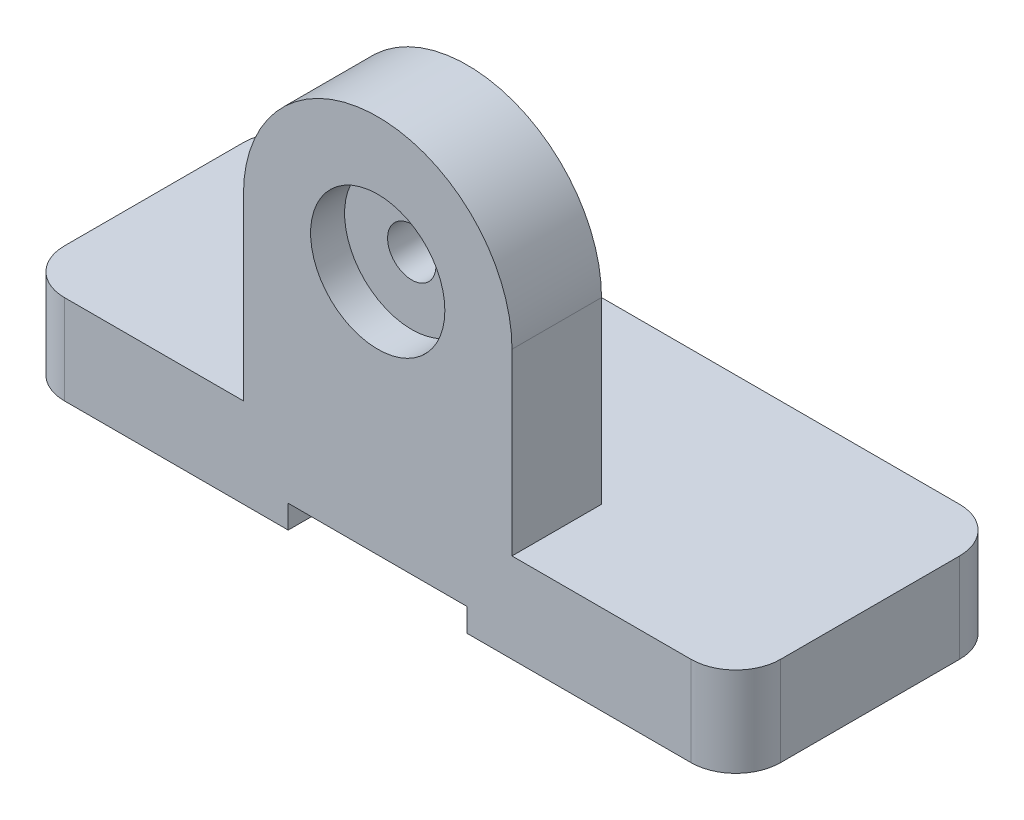
ISO-10303-21;
HEADER;
FILE_DESCRIPTION(('STEP AP214'),'2;1');
FILE_NAME('part.step','',(''),(''),'','','');
FILE_SCHEMA(('AUTOMOTIVE_DESIGN { 1 0 10303 214 1 1 1 1 }'));
ENDSEC;
DATA;
#1=APPLICATION_CONTEXT('core data for automotive mechanical design processes');
#2=APPLICATION_PROTOCOL_DEFINITION('international standard','automotive_design',2000,#1);
#3=PRODUCT_CONTEXT('',#1,'mechanical');
#4=PRODUCT('Part','Part','',(#3));
#5=PRODUCT_RELATED_PRODUCT_CATEGORY('part','',(#4));
#6=PRODUCT_DEFINITION_FORMATION('','',#4);
#7=PRODUCT_DEFINITION_CONTEXT('part definition',#1,'design');
#8=PRODUCT_DEFINITION('design','',#6,#7);
#9=PRODUCT_DEFINITION_SHAPE('','',#8);
#10=(LENGTH_UNIT() NAMED_UNIT(*) SI_UNIT(.MILLI.,.METRE.));
#11=(NAMED_UNIT(*) PLANE_ANGLE_UNIT() SI_UNIT($,.RADIAN.));
#12=(NAMED_UNIT(*) SI_UNIT($,.STERADIAN.) SOLID_ANGLE_UNIT());
#13=UNCERTAINTY_MEASURE_WITH_UNIT(LENGTH_MEASURE(1.E-05),#10,'distance_accuracy_value','');
#14=(GEOMETRIC_REPRESENTATION_CONTEXT(3) GLOBAL_UNCERTAINTY_ASSIGNED_CONTEXT((#13)) GLOBAL_UNIT_ASSIGNED_CONTEXT((#10,
#11,#12)) REPRESENTATION_CONTEXT('',''));
#15=CARTESIAN_POINT('',(0.,0.,0.));
#16=DIRECTION('',(0.,0.,1.));
#17=DIRECTION('',(1.,0.,0.));
#18=AXIS2_PLACEMENT_3D('',#15,#16,#17);
#19=CARTESIAN_POINT('',(0.,0.,0.));
#20=DIRECTION('',(0.,1.,0.));
#21=DIRECTION('',(0.,0.,1.));
#22=AXIS2_PLACEMENT_3D('',#19,#20,#21);
#23=PLANE('',#22);
#24=DIRECTION('',(0.,0.,1.));
#25=VECTOR('',#24,1.);
#26=CARTESIAN_POINT('',(-50.8,0.,19.05));
#27=LINE('',#26,#25);
#28=CARTESIAN_POINT('',(-50.8,0.,-12.7));
#29=VERTEX_POINT('',#28);
#30=CARTESIAN_POINT('',(-50.8,0.,12.7));
#31=VERTEX_POINT('',#30);
#32=EDGE_CURVE('E206',#29,#31,#27,.T.);
#33=ORIENTED_EDGE('',*,*,#32,.F.);
#34=CARTESIAN_POINT('',(-44.45,0.,-12.7));
#35=DIRECTION('',(0.,1.,0.));
#36=DIRECTION('',(0.,0.,1.));
#37=AXIS2_PLACEMENT_3D('',#34,#35,#36);
#38=CIRCLE('',#37,6.35);
#39=CARTESIAN_POINT('',(-44.45,0.,-19.05));
#40=VERTEX_POINT('',#39);
#41=EDGE_CURVE('E245',#29,#40,#38,.F.);
#42=ORIENTED_EDGE('',*,*,#41,.T.);
#43=DIRECTION('',(-1.,0.,0.));
#44=VECTOR('',#43,1.);
#45=CARTESIAN_POINT('',(50.8,0.,-19.05));
#46=LINE('',#45,#44);
#47=CARTESIAN_POINT('',(-12.7,0.,-19.05));
#48=VERTEX_POINT('',#47);
#49=EDGE_CURVE('E232',#48,#40,#46,.T.);
#50=ORIENTED_EDGE('',*,*,#49,.F.);
#51=DIRECTION('',(0.,0.,1.));
#52=VECTOR('',#51,1.);
#53=CARTESIAN_POINT('',(-12.7,0.,-19.05));
#54=LINE('',#53,#52);
#55=CARTESIAN_POINT('',(-12.7,0.,19.05));
#56=VERTEX_POINT('',#55);
#57=EDGE_CURVE('E195',#48,#56,#54,.T.);
#58=ORIENTED_EDGE('',*,*,#57,.T.);
#59=DIRECTION('',(1.,0.,0.));
#60=VECTOR('',#59,1.);
#61=CARTESIAN_POINT('',(50.8,0.,19.05));
#62=LINE('',#61,#60);
#63=CARTESIAN_POINT('',(-44.45,0.,19.05));
#64=VERTEX_POINT('',#63);
#65=EDGE_CURVE('E228',#64,#56,#62,.T.);
#66=ORIENTED_EDGE('',*,*,#65,.F.);
#67=CARTESIAN_POINT('',(-44.45,0.,12.7));
#68=DIRECTION('',(0.,1.,0.));
#69=DIRECTION('',(0.,0.,1.));
#70=AXIS2_PLACEMENT_3D('',#67,#68,#69);
#71=CIRCLE('',#70,6.35);
#72=EDGE_CURVE('E243',#64,#31,#71,.F.);
#73=ORIENTED_EDGE('',*,*,#72,.T.);
#74=EDGE_LOOP('',(#33,#42,#50,#58,#66,#73));
#75=FACE_BOUND('',#74,.T.);
#76=ADVANCED_FACE('F36',(#75),#23,.F.);
#77=CARTESIAN_POINT('',(-50.8,12.7,19.05));
#78=DIRECTION('',(1.,0.,0.));
#79=DIRECTION('',(0.,0.,-1.));
#80=AXIS2_PLACEMENT_3D('',#77,#78,#79);
#81=PLANE('',#80);
#82=DIRECTION('',(0.,0.,1.));
#83=VECTOR('',#82,1.);
#84=CARTESIAN_POINT('',(-50.8,12.7,19.05));
#85=LINE('',#84,#83);
#86=CARTESIAN_POINT('',(-50.8,12.7,-12.7));
#87=VERTEX_POINT('',#86);
#88=CARTESIAN_POINT('',(-50.8,12.7,12.7));
#89=VERTEX_POINT('',#88);
#90=EDGE_CURVE('E213',#87,#89,#85,.T.);
#91=ORIENTED_EDGE('',*,*,#90,.F.);
#92=DIRECTION('',(0.,-1.,0.));
#93=VECTOR('',#92,1.);
#94=CARTESIAN_POINT('',(-50.8,12.7,-12.7));
#95=LINE('',#94,#93);
#96=EDGE_CURVE('E240',#87,#29,#95,.T.);
#97=ORIENTED_EDGE('',*,*,#96,.T.);
#98=ORIENTED_EDGE('',*,*,#32,.T.);
#99=DIRECTION('',(0.,-1.,0.));
#100=VECTOR('',#99,1.);
#101=CARTESIAN_POINT('',(-50.8,12.7,12.7));
#102=LINE('',#101,#100);
#103=EDGE_CURVE('E224',#31,#89,#102,.F.);
#104=ORIENTED_EDGE('',*,*,#103,.T.);
#105=EDGE_LOOP('',(#91,#97,#98,#104));
#106=FACE_BOUND('',#105,.T.);
#107=ADVANCED_FACE('F305',(#106),#81,.F.);
#108=CARTESIAN_POINT('',(50.8,12.7,19.05));
#109=DIRECTION('',(0.,0.,-1.));
#110=DIRECTION('',(-1.,0.,0.));
#111=AXIS2_PLACEMENT_3D('',#108,#109,#110);
#112=PLANE('',#111);
#113=CARTESIAN_POINT('',(0.,38.1,19.05));
#114=DIRECTION('',(0.,0.,1.));
#115=DIRECTION('',(1.,0.,0.));
#116=AXIS2_PLACEMENT_3D('',#113,#114,#115);
#117=CIRCLE('',#116,9.525);
#118=CARTESIAN_POINT('',(9.525,38.1,19.05));
#119=VERTEX_POINT('',#118);
#120=EDGE_CURVE('E506',#119,#119,#117,.T.);
#121=ORIENTED_EDGE('',*,*,#120,.F.);
#122=EDGE_LOOP('',(#121));
#123=FACE_BOUND('',#122,.T.);
#124=DIRECTION('',(1.,0.,0.));
#125=VECTOR('',#124,1.);
#126=CARTESIAN_POINT('',(50.8,12.7,19.05));
#127=LINE('',#126,#125);
#128=CARTESIAN_POINT('',(-44.45,12.7,19.05));
#129=VERTEX_POINT('',#128);
#130=CARTESIAN_POINT('',(-19.05,12.7,19.05));
#131=VERTEX_POINT('',#130);
#132=EDGE_CURVE('E176',#129,#131,#127,.T.);
#133=ORIENTED_EDGE('',*,*,#132,.F.);
#134=DIRECTION('',(0.,-1.,0.));
#135=VECTOR('',#134,1.);
#136=CARTESIAN_POINT('',(-44.45,12.7,19.05));
#137=LINE('',#136,#135);
#138=EDGE_CURVE('E11',#129,#64,#137,.T.);
#139=ORIENTED_EDGE('',*,*,#138,.T.);
#140=ORIENTED_EDGE('',*,*,#65,.T.);
#141=DIRECTION('',(0.,-1.,0.));
#142=VECTOR('',#141,1.);
#143=CARTESIAN_POINT('',(-12.7,0.,19.05));
#144=LINE('',#143,#142);
#145=CARTESIAN_POINT('',(-12.7,3.302,19.05));
#146=VERTEX_POINT('',#145);
#147=EDGE_CURVE('E196',#146,#56,#144,.T.);
#148=ORIENTED_EDGE('',*,*,#147,.F.);
#149=DIRECTION('',(-1.,0.,0.));
#150=VECTOR('',#149,1.);
#151=CARTESIAN_POINT('',(-12.7,3.302,19.05));
#152=LINE('',#151,#150);
#153=CARTESIAN_POINT('',(12.7,3.302,19.05));
#154=VERTEX_POINT('',#153);
#155=EDGE_CURVE('E189',#154,#146,#152,.T.);
#156=ORIENTED_EDGE('',*,*,#155,.F.);
#157=DIRECTION('',(0.,1.,0.));
#158=VECTOR('',#157,1.);
#159=CARTESIAN_POINT('',(12.7,0.,19.05));
#160=LINE('',#159,#158);
#161=CARTESIAN_POINT('',(12.7,0.,19.05));
#162=VERTEX_POINT('',#161);
#163=EDGE_CURVE('E199',#162,#154,#160,.T.);
#164=ORIENTED_EDGE('',*,*,#163,.F.);
#165=CARTESIAN_POINT('',(44.45,0.,19.05));
#166=VERTEX_POINT('',#165);
#167=EDGE_CURVE('E227',#162,#166,#62,.T.);
#168=ORIENTED_EDGE('',*,*,#167,.T.);
#169=DIRECTION('',(0.,-1.,0.));
#170=VECTOR('',#169,1.);
#171=CARTESIAN_POINT('',(44.45,12.7,19.05));
#172=LINE('',#171,#170);
#173=CARTESIAN_POINT('',(44.45,12.7,19.05));
#174=VERTEX_POINT('',#173);
#175=EDGE_CURVE('E44',#166,#174,#172,.F.);
#176=ORIENTED_EDGE('',*,*,#175,.T.);
#177=CARTESIAN_POINT('',(19.05,12.7,19.05));
#178=VERTEX_POINT('',#177);
#179=EDGE_CURVE('E216',#178,#174,#127,.T.);
#180=ORIENTED_EDGE('',*,*,#179,.F.);
#181=DIRECTION('',(0.,1.,0.));
#182=VECTOR('',#181,1.);
#183=CARTESIAN_POINT('',(19.05,12.7,19.05));
#184=LINE('',#183,#182);
#185=CARTESIAN_POINT('',(19.05,38.1,19.05));
#186=VERTEX_POINT('',#185);
#187=EDGE_CURVE('E316',#178,#186,#184,.T.);
#188=ORIENTED_EDGE('',*,*,#187,.T.);
#189=CARTESIAN_POINT('',(0.,38.1,19.05));
#190=DIRECTION('',(0.,0.,1.));
#191=DIRECTION('',(-1.,0.,0.));
#192=AXIS2_PLACEMENT_3D('',#189,#190,#191);
#193=CIRCLE('',#192,19.05);
#194=CARTESIAN_POINT('',(-19.05,38.1,19.05));
#195=VERTEX_POINT('',#194);
#196=EDGE_CURVE('E171',#186,#195,#193,.T.);
#197=ORIENTED_EDGE('',*,*,#196,.T.);
#198=DIRECTION('',(0.,-1.,0.));
#199=VECTOR('',#198,1.);
#200=CARTESIAN_POINT('',(-19.05,12.7,19.05));
#201=LINE('',#200,#199);
#202=EDGE_CURVE('E237',#195,#131,#201,.T.);
#203=ORIENTED_EDGE('',*,*,#202,.T.);
#204=EDGE_LOOP('',(#133,#139,#140,#148,#156,#164,#168,#176,#180,#188,#197,#203));
#205=FACE_BOUND('',#204,.T.);
#206=ADVANCED_FACE('F269',(#123,#205),#112,.F.);
#207=CARTESIAN_POINT('',(50.8,12.7,19.05));
#208=DIRECTION('',(-1.,0.,0.));
#209=DIRECTION('',(0.,0.,1.));
#210=AXIS2_PLACEMENT_3D('',#207,#208,#209);
#211=PLANE('',#210);
#212=DIRECTION('',(0.,0.,-1.));
#213=VECTOR('',#212,1.);
#214=CARTESIAN_POINT('',(50.8,0.,19.05));
#215=LINE('',#214,#213);
#216=CARTESIAN_POINT('',(50.8,0.,12.7));
#217=VERTEX_POINT('',#216);
#218=CARTESIAN_POINT('',(50.8,0.,-12.7));
#219=VERTEX_POINT('',#218);
#220=EDGE_CURVE('E230',#217,#219,#215,.T.);
#221=ORIENTED_EDGE('',*,*,#220,.T.);
#222=DIRECTION('',(0.,-1.,0.));
#223=VECTOR('',#222,1.);
#224=CARTESIAN_POINT('',(50.8,12.7,-12.7));
#225=LINE('',#224,#223);
#226=CARTESIAN_POINT('',(50.8,12.7,-12.7));
#227=VERTEX_POINT('',#226);
#228=EDGE_CURVE('E264',#219,#227,#225,.F.);
#229=ORIENTED_EDGE('',*,*,#228,.T.);
#230=DIRECTION('',(0.,0.,-1.));
#231=VECTOR('',#230,1.);
#232=CARTESIAN_POINT('',(50.8,12.7,19.05));
#233=LINE('',#232,#231);
#234=CARTESIAN_POINT('',(50.8,12.7,12.7));
#235=VERTEX_POINT('',#234);
#236=EDGE_CURVE('E219',#235,#227,#233,.T.);
#237=ORIENTED_EDGE('',*,*,#236,.F.);
#238=DIRECTION('',(0.,-1.,0.));
#239=VECTOR('',#238,1.);
#240=CARTESIAN_POINT('',(50.8,12.7,12.7));
#241=LINE('',#240,#239);
#242=EDGE_CURVE('E262',#235,#217,#241,.T.);
#243=ORIENTED_EDGE('',*,*,#242,.T.);
#244=EDGE_LOOP('',(#221,#229,#237,#243));
#245=FACE_BOUND('',#244,.T.);
#246=ADVANCED_FACE('F276',(#245),#211,.F.);
#247=CARTESIAN_POINT('',(50.8,12.7,-19.05));
#248=DIRECTION('',(0.,0.,1.));
#249=DIRECTION('',(1.,0.,0.));
#250=AXIS2_PLACEMENT_3D('',#247,#248,#249);
#251=PLANE('',#250);
#252=ORIENTED_EDGE('',*,*,#49,.T.);
#253=DIRECTION('',(0.,-1.,0.));
#254=VECTOR('',#253,1.);
#255=CARTESIAN_POINT('',(-44.45,12.7,-19.05));
#256=LINE('',#255,#254);
#257=CARTESIAN_POINT('',(-44.45,12.7,-19.05));
#258=VERTEX_POINT('',#257);
#259=EDGE_CURVE('E250',#40,#258,#256,.F.);
#260=ORIENTED_EDGE('',*,*,#259,.T.);
#261=DIRECTION('',(-1.,0.,0.));
#262=VECTOR('',#261,1.);
#263=CARTESIAN_POINT('',(50.8,12.7,-19.05));
#264=LINE('',#263,#262);
#265=CARTESIAN_POINT('',(44.45,12.7,-19.05));
#266=VERTEX_POINT('',#265);
#267=EDGE_CURVE('E222',#266,#258,#264,.T.);
#268=ORIENTED_EDGE('',*,*,#267,.F.);
#269=DIRECTION('',(0.,-1.,0.));
#270=VECTOR('',#269,1.);
#271=CARTESIAN_POINT('',(44.45,12.7,-19.05));
#272=LINE('',#271,#270);
#273=CARTESIAN_POINT('',(44.45,0.,-19.05));
#274=VERTEX_POINT('',#273);
#275=EDGE_CURVE('E247',#266,#274,#272,.T.);
#276=ORIENTED_EDGE('',*,*,#275,.T.);
#277=CARTESIAN_POINT('',(12.7,0.,-19.05));
#278=VERTEX_POINT('',#277);
#279=EDGE_CURVE('E217',#274,#278,#46,.T.);
#280=ORIENTED_EDGE('',*,*,#279,.T.);
#281=DIRECTION('',(0.,1.,0.));
#282=VECTOR('',#281,1.);
#283=CARTESIAN_POINT('',(12.7,0.,-19.05));
#284=LINE('',#283,#282);
#285=CARTESIAN_POINT('',(12.7,3.302,-19.05));
#286=VERTEX_POINT('',#285);
#287=EDGE_CURVE('E188',#278,#286,#284,.T.);
#288=ORIENTED_EDGE('',*,*,#287,.T.);
#289=DIRECTION('',(-1.,0.,0.));
#290=VECTOR('',#289,1.);
#291=CARTESIAN_POINT('',(-12.7,3.302,-19.05));
#292=LINE('',#291,#290);
#293=CARTESIAN_POINT('',(-12.7,3.302,-19.05));
#294=VERTEX_POINT('',#293);
#295=EDGE_CURVE('E192',#286,#294,#292,.T.);
#296=ORIENTED_EDGE('',*,*,#295,.T.);
#297=DIRECTION('',(0.,-1.,0.));
#298=VECTOR('',#297,1.);
#299=CARTESIAN_POINT('',(-12.7,0.,-19.05));
#300=LINE('',#299,#298);
#301=EDGE_CURVE('E185',#294,#48,#300,.T.);
#302=ORIENTED_EDGE('',*,*,#301,.T.);
#303=EDGE_LOOP('',(#252,#260,#268,#276,#280,#288,#296,#302));
#304=FACE_BOUND('',#303,.T.);
#305=ADVANCED_FACE('F291',(#304),#251,.F.);
#306=CARTESIAN_POINT('',(0.,12.7,0.));
#307=DIRECTION('',(0.,1.,0.));
#308=DIRECTION('',(0.,0.,1.));
#309=AXIS2_PLACEMENT_3D('',#306,#307,#308);
#310=PLANE('',#309);
#311=ORIENTED_EDGE('',*,*,#267,.T.);
#312=CARTESIAN_POINT('',(-44.45,12.7,-12.7));
#313=DIRECTION('',(0.,1.,0.));
#314=DIRECTION('',(0.,0.,1.));
#315=AXIS2_PLACEMENT_3D('',#312,#313,#314);
#316=CIRCLE('',#315,6.35);
#317=EDGE_CURVE('E258',#258,#87,#316,.T.);
#318=ORIENTED_EDGE('',*,*,#317,.T.);
#319=ORIENTED_EDGE('',*,*,#90,.T.);
#320=CARTESIAN_POINT('',(-44.45,12.7,12.7));
#321=DIRECTION('',(0.,1.,0.));
#322=DIRECTION('',(0.,0.,1.));
#323=AXIS2_PLACEMENT_3D('',#320,#321,#322);
#324=CIRCLE('',#323,6.35);
#325=EDGE_CURVE('E254',#89,#129,#324,.T.);
#326=ORIENTED_EDGE('',*,*,#325,.T.);
#327=ORIENTED_EDGE('',*,*,#132,.T.);
#328=DIRECTION('',(0.,0.,1.));
#329=VECTOR('',#328,1.);
#330=CARTESIAN_POINT('',(-19.05,12.7,6.35));
#331=LINE('',#330,#329);
#332=CARTESIAN_POINT('',(-19.05,12.7,6.35));
#333=VERTEX_POINT('',#332);
#334=EDGE_CURVE('E168',#333,#131,#331,.T.);
#335=ORIENTED_EDGE('',*,*,#334,.F.);
#336=DIRECTION('',(1.,0.,0.));
#337=VECTOR('',#336,1.);
#338=CARTESIAN_POINT('',(-19.05,12.7,6.35));
#339=LINE('',#338,#337);
#340=CARTESIAN_POINT('',(19.05,12.7,6.35));
#341=VERTEX_POINT('',#340);
#342=EDGE_CURVE('E152',#333,#341,#339,.T.);
#343=ORIENTED_EDGE('',*,*,#342,.T.);
#344=DIRECTION('',(0.,0.,1.));
#345=VECTOR('',#344,1.);
#346=CARTESIAN_POINT('',(19.05,12.7,6.35));
#347=LINE('',#346,#345);
#348=EDGE_CURVE('E177',#341,#178,#347,.T.);
#349=ORIENTED_EDGE('',*,*,#348,.T.);
#350=ORIENTED_EDGE('',*,*,#179,.T.);
#351=CARTESIAN_POINT('',(44.45,12.7,12.7));
#352=DIRECTION('',(0.,1.,0.));
#353=DIRECTION('',(0.,0.,1.));
#354=AXIS2_PLACEMENT_3D('',#351,#352,#353);
#355=CIRCLE('',#354,6.35);
#356=EDGE_CURVE('E252',#174,#235,#355,.T.);
#357=ORIENTED_EDGE('',*,*,#356,.T.);
#358=ORIENTED_EDGE('',*,*,#236,.T.);
#359=CARTESIAN_POINT('',(44.45,12.7,-12.7));
#360=DIRECTION('',(0.,1.,0.));
#361=DIRECTION('',(0.,0.,1.));
#362=AXIS2_PLACEMENT_3D('',#359,#360,#361);
#363=CIRCLE('',#362,6.35);
#364=EDGE_CURVE('E256',#227,#266,#363,.T.);
#365=ORIENTED_EDGE('',*,*,#364,.T.);
#366=EDGE_LOOP('',(#311,#318,#319,#326,#327,#335,#343,#349,#350,#357,#358,#365));
#367=FACE_BOUND('',#366,.T.);
#368=ADVANCED_FACE('F174',(#367),#310,.T.);
#369=ORIENTED_EDGE('',*,*,#279,.F.);
#370=CARTESIAN_POINT('',(44.45,0.,-12.7));
#371=DIRECTION('',(0.,1.,0.));
#372=DIRECTION('',(0.,0.,1.));
#373=AXIS2_PLACEMENT_3D('',#370,#371,#372);
#374=CIRCLE('',#373,6.35);
#375=EDGE_CURVE('E51',#274,#219,#374,.F.);
#376=ORIENTED_EDGE('',*,*,#375,.T.);
#377=ORIENTED_EDGE('',*,*,#220,.F.);
#378=CARTESIAN_POINT('',(44.45,0.,12.7));
#379=DIRECTION('',(0.,1.,0.));
#380=DIRECTION('',(0.,0.,1.));
#381=AXIS2_PLACEMENT_3D('',#378,#379,#380);
#382=CIRCLE('',#381,6.35);
#383=EDGE_CURVE('E59',#217,#166,#382,.F.);
#384=ORIENTED_EDGE('',*,*,#383,.T.);
#385=ORIENTED_EDGE('',*,*,#167,.F.);
#386=DIRECTION('',(0.,0.,1.));
#387=VECTOR('',#386,1.);
#388=CARTESIAN_POINT('',(12.7,0.,-19.05));
#389=LINE('',#388,#387);
#390=EDGE_CURVE('E209',#278,#162,#389,.T.);
#391=ORIENTED_EDGE('',*,*,#390,.F.);
#392=EDGE_LOOP('',(#369,#376,#377,#384,#385,#391));
#393=FACE_BOUND('',#392,.T.);
#394=ADVANCED_FACE('F278',(#393),#23,.F.);
#395=CARTESIAN_POINT('',(-12.7,0.,-19.05));
#396=DIRECTION('',(-1.,0.,0.));
#397=DIRECTION('',(0.,0.,1.));
#398=AXIS2_PLACEMENT_3D('',#395,#396,#397);
#399=PLANE('',#398);
#400=ORIENTED_EDGE('',*,*,#147,.T.);
#401=ORIENTED_EDGE('',*,*,#57,.F.);
#402=ORIENTED_EDGE('',*,*,#301,.F.);
#403=DIRECTION('',(0.,0.,1.));
#404=VECTOR('',#403,1.);
#405=CARTESIAN_POINT('',(-12.7,3.302,-19.05));
#406=LINE('',#405,#404);
#407=EDGE_CURVE('E204',#294,#146,#406,.T.);
#408=ORIENTED_EDGE('',*,*,#407,.T.);
#409=EDGE_LOOP('',(#400,#401,#402,#408));
#410=FACE_BOUND('',#409,.T.);
#411=ADVANCED_FACE('F344',(#410),#399,.F.);
#412=CARTESIAN_POINT('',(-12.7,3.302,-19.05));
#413=DIRECTION('',(0.,1.,0.));
#414=DIRECTION('',(0.,0.,1.));
#415=AXIS2_PLACEMENT_3D('',#412,#413,#414);
#416=PLANE('',#415);
#417=ORIENTED_EDGE('',*,*,#155,.T.);
#418=ORIENTED_EDGE('',*,*,#407,.F.);
#419=ORIENTED_EDGE('',*,*,#295,.F.);
#420=DIRECTION('',(0.,0.,1.));
#421=VECTOR('',#420,1.);
#422=CARTESIAN_POINT('',(12.7,3.302,-19.05));
#423=LINE('',#422,#421);
#424=EDGE_CURVE('E207',#286,#154,#423,.T.);
#425=ORIENTED_EDGE('',*,*,#424,.T.);
#426=EDGE_LOOP('',(#417,#418,#419,#425));
#427=FACE_BOUND('',#426,.T.);
#428=ADVANCED_FACE('F286',(#427),#416,.F.);
#429=CARTESIAN_POINT('',(12.7,0.,-19.05));
#430=DIRECTION('',(1.,0.,0.));
#431=DIRECTION('',(0.,0.,-1.));
#432=AXIS2_PLACEMENT_3D('',#429,#430,#431);
#433=PLANE('',#432);
#434=ORIENTED_EDGE('',*,*,#163,.T.);
#435=ORIENTED_EDGE('',*,*,#424,.F.);
#436=ORIENTED_EDGE('',*,*,#287,.F.);
#437=ORIENTED_EDGE('',*,*,#390,.T.);
#438=EDGE_LOOP('',(#434,#435,#436,#437));
#439=FACE_BOUND('',#438,.T.);
#440=ADVANCED_FACE('F282',(#439),#433,.F.);
#441=CARTESIAN_POINT('',(-19.05,12.7,6.35));
#442=DIRECTION('',(-1.,0.,0.));
#443=DIRECTION('',(0.,0.,1.));
#444=AXIS2_PLACEMENT_3D('',#441,#442,#443);
#445=PLANE('',#444);
#446=ORIENTED_EDGE('',*,*,#202,.F.);
#447=DIRECTION('',(0.,0.,1.));
#448=VECTOR('',#447,1.);
#449=CARTESIAN_POINT('',(-19.05,38.1,6.35));
#450=LINE('',#449,#448);
#451=CARTESIAN_POINT('',(-19.05,38.1,6.35));
#452=VERTEX_POINT('',#451);
#453=EDGE_CURVE('E170',#452,#195,#450,.T.);
#454=ORIENTED_EDGE('',*,*,#453,.F.);
#455=DIRECTION('',(0.,-1.,0.));
#456=VECTOR('',#455,1.);
#457=CARTESIAN_POINT('',(-19.05,12.7,6.35));
#458=LINE('',#457,#456);
#459=EDGE_CURVE('E156',#452,#333,#458,.T.);
#460=ORIENTED_EDGE('',*,*,#459,.T.);
#461=ORIENTED_EDGE('',*,*,#334,.T.);
#462=EDGE_LOOP('',(#446,#454,#460,#461));
#463=FACE_BOUND('',#462,.T.);
#464=ADVANCED_FACE('F167',(#463),#445,.T.);
#465=CARTESIAN_POINT('',(0.,38.1,6.35));
#466=DIRECTION('',(0.,0.,1.));
#467=DIRECTION('',(1.,0.,0.));
#468=AXIS2_PLACEMENT_3D('',#465,#466,#467);
#469=CYLINDRICAL_SURFACE('',#468,19.05);
#470=ORIENTED_EDGE('',*,*,#196,.F.);
#471=DIRECTION('',(0.,0.,1.));
#472=VECTOR('',#471,1.);
#473=CARTESIAN_POINT('',(19.05,38.1,6.35));
#474=LINE('',#473,#472);
#475=CARTESIAN_POINT('',(19.05,38.1,6.35));
#476=VERTEX_POINT('',#475);
#477=EDGE_CURVE('E180',#476,#186,#474,.T.);
#478=ORIENTED_EDGE('',*,*,#477,.F.);
#479=CARTESIAN_POINT('',(0.,38.1,6.35));
#480=DIRECTION('',(0.,0.,1.));
#481=DIRECTION('',(-1.,0.,0.));
#482=AXIS2_PLACEMENT_3D('',#479,#480,#481);
#483=CIRCLE('',#482,19.05);
#484=EDGE_CURVE('E178',#476,#452,#483,.T.);
#485=ORIENTED_EDGE('',*,*,#484,.T.);
#486=ORIENTED_EDGE('',*,*,#453,.T.);
#487=EDGE_LOOP('',(#470,#478,#485,#486));
#488=FACE_BOUND('',#487,.T.);
#489=ADVANCED_FACE('F325',(#488),#469,.T.);
#490=CARTESIAN_POINT('',(19.05,12.7,6.35));
#491=DIRECTION('',(1.,0.,0.));
#492=DIRECTION('',(0.,0.,-1.));
#493=AXIS2_PLACEMENT_3D('',#490,#491,#492);
#494=PLANE('',#493);
#495=ORIENTED_EDGE('',*,*,#187,.F.);
#496=ORIENTED_EDGE('',*,*,#348,.F.);
#497=DIRECTION('',(0.,1.,0.));
#498=VECTOR('',#497,1.);
#499=CARTESIAN_POINT('',(19.05,12.7,6.35));
#500=LINE('',#499,#498);
#501=EDGE_CURVE('E159',#341,#476,#500,.T.);
#502=ORIENTED_EDGE('',*,*,#501,.T.);
#503=ORIENTED_EDGE('',*,*,#477,.T.);
#504=EDGE_LOOP('',(#495,#496,#502,#503));
#505=FACE_BOUND('',#504,.T.);
#506=ADVANCED_FACE('F323',(#505),#494,.T.);
#507=CARTESIAN_POINT('',(0.,38.1,6.35));
#508=DIRECTION('',(0.,0.,-1.));
#509=DIRECTION('',(-1.,0.,0.));
#510=AXIS2_PLACEMENT_3D('',#507,#508,#509);
#511=PLANE('',#510);
#512=CARTESIAN_POINT('',(0.,38.1,6.35));
#513=DIRECTION('',(0.,0.,-1.));
#514=DIRECTION('',(-1.,0.,0.));
#515=AXIS2_PLACEMENT_3D('',#512,#513,#514);
#516=CIRCLE('',#515,3.429);
#517=CARTESIAN_POINT('',(-3.42899999999999,38.1,6.35));
#518=VERTEX_POINT('',#517);
#519=EDGE_CURVE('E234',#518,#518,#516,.T.);
#520=ORIENTED_EDGE('',*,*,#519,.F.);
#521=EDGE_LOOP('',(#520));
#522=FACE_BOUND('',#521,.T.);
#523=ORIENTED_EDGE('',*,*,#459,.F.);
#524=ORIENTED_EDGE('',*,*,#484,.F.);
#525=ORIENTED_EDGE('',*,*,#501,.F.);
#526=ORIENTED_EDGE('',*,*,#342,.F.);
#527=EDGE_LOOP('',(#523,#524,#525,#526));
#528=FACE_BOUND('',#527,.T.);
#529=ADVANCED_FACE('F154',(#522,#528),#511,.T.);
#530=CARTESIAN_POINT('',(0.,38.1,19.05));
#531=DIRECTION('',(0.,0.,1.));
#532=DIRECTION('',(1.,0.,0.));
#533=AXIS2_PLACEMENT_3D('',#530,#531,#532);
#534=CYLINDRICAL_SURFACE('',#533,3.429);
#535=ORIENTED_EDGE('',*,*,#519,.T.);
#536=EDGE_LOOP('',(#535));
#537=FACE_BOUND('',#536,.T.);
#538=CARTESIAN_POINT('',(0.,38.1,14.224));
#539=DIRECTION('',(0.,0.,1.));
#540=DIRECTION('',(1.,0.,0.));
#541=AXIS2_PLACEMENT_3D('',#538,#539,#540);
#542=CIRCLE('',#541,3.429);
#543=CARTESIAN_POINT('',(3.42900000000001,38.1,14.224));
#544=VERTEX_POINT('',#543);
#545=EDGE_CURVE('E238',#544,#544,#542,.T.);
#546=ORIENTED_EDGE('',*,*,#545,.T.);
#547=EDGE_LOOP('',(#546));
#548=FACE_BOUND('',#547,.T.);
#549=ADVANCED_FACE('F390',(#537,#548),#534,.F.);
#550=CARTESIAN_POINT('',(3.42900000000001,38.1,14.224));
#551=DIRECTION('',(0.,0.,-1.));
#552=DIRECTION('',(-1.,0.,0.));
#553=AXIS2_PLACEMENT_3D('',#550,#551,#552);
#554=PLANE('',#553);
#555=ORIENTED_EDGE('',*,*,#545,.F.);
#556=EDGE_LOOP('',(#555));
#557=FACE_BOUND('',#556,.T.);
#558=CARTESIAN_POINT('',(0.,38.1,14.224));
#559=DIRECTION('',(0.,0.,1.));
#560=DIRECTION('',(1.,0.,0.));
#561=AXIS2_PLACEMENT_3D('',#558,#559,#560);
#562=CIRCLE('',#561,9.525);
#563=CARTESIAN_POINT('',(9.525,38.1,14.224));
#564=VERTEX_POINT('',#563);
#565=EDGE_CURVE('E508',#564,#564,#562,.T.);
#566=ORIENTED_EDGE('',*,*,#565,.T.);
#567=EDGE_LOOP('',(#566));
#568=FACE_BOUND('',#567,.T.);
#569=ADVANCED_FACE('F399',(#557,#568),#554,.F.);
#570=CARTESIAN_POINT('',(0.,38.1,19.05));
#571=DIRECTION('',(0.,0.,1.));
#572=DIRECTION('',(1.,0.,0.));
#573=AXIS2_PLACEMENT_3D('',#570,#571,#572);
#574=CYLINDRICAL_SURFACE('',#573,9.525);
#575=ORIENTED_EDGE('',*,*,#565,.F.);
#576=EDGE_LOOP('',(#575));
#577=FACE_BOUND('',#576,.T.);
#578=ORIENTED_EDGE('',*,*,#120,.T.);
#579=EDGE_LOOP('',(#578));
#580=FACE_BOUND('',#579,.T.);
#581=ADVANCED_FACE('F409',(#577,#580),#574,.F.);
#582=CARTESIAN_POINT('',(-44.45,12.7,-12.7));
#583=DIRECTION('',(0.,-1.,0.));
#584=DIRECTION('',(0.,0.,-1.));
#585=AXIS2_PLACEMENT_3D('',#582,#583,#584);
#586=CYLINDRICAL_SURFACE('',#585,6.35);
#587=ORIENTED_EDGE('',*,*,#317,.F.);
#588=ORIENTED_EDGE('',*,*,#259,.F.);
#589=ORIENTED_EDGE('',*,*,#41,.F.);
#590=ORIENTED_EDGE('',*,*,#96,.F.);
#591=EDGE_LOOP('',(#587,#588,#589,#590));
#592=FACE_BOUND('',#591,.T.);
#593=ADVANCED_FACE('F302',(#592),#586,.T.);
#594=CARTESIAN_POINT('',(44.45,12.7,-12.7));
#595=DIRECTION('',(0.,-1.,0.));
#596=DIRECTION('',(0.,0.,-1.));
#597=AXIS2_PLACEMENT_3D('',#594,#595,#596);
#598=CYLINDRICAL_SURFACE('',#597,6.35);
#599=ORIENTED_EDGE('',*,*,#364,.F.);
#600=ORIENTED_EDGE('',*,*,#228,.F.);
#601=ORIENTED_EDGE('',*,*,#375,.F.);
#602=ORIENTED_EDGE('',*,*,#275,.F.);
#603=EDGE_LOOP('',(#599,#600,#601,#602));
#604=FACE_BOUND('',#603,.T.);
#605=ADVANCED_FACE('F296',(#604),#598,.T.);
#606=CARTESIAN_POINT('',(-44.45,12.7,12.7));
#607=DIRECTION('',(0.,-1.,0.));
#608=DIRECTION('',(0.,0.,-1.));
#609=AXIS2_PLACEMENT_3D('',#606,#607,#608);
#610=CYLINDRICAL_SURFACE('',#609,6.35);
#611=ORIENTED_EDGE('',*,*,#325,.F.);
#612=ORIENTED_EDGE('',*,*,#103,.F.);
#613=ORIENTED_EDGE('',*,*,#72,.F.);
#614=ORIENTED_EDGE('',*,*,#138,.F.);
#615=EDGE_LOOP('',(#611,#612,#613,#614));
#616=FACE_BOUND('',#615,.T.);
#617=ADVANCED_FACE('F313',(#616),#610,.T.);
#618=CARTESIAN_POINT('',(44.45,12.7,12.7));
#619=DIRECTION('',(0.,-1.,0.));
#620=DIRECTION('',(0.,0.,-1.));
#621=AXIS2_PLACEMENT_3D('',#618,#619,#620);
#622=CYLINDRICAL_SURFACE('',#621,6.35);
#623=ORIENTED_EDGE('',*,*,#356,.F.);
#624=ORIENTED_EDGE('',*,*,#175,.F.);
#625=ORIENTED_EDGE('',*,*,#383,.F.);
#626=ORIENTED_EDGE('',*,*,#242,.F.);
#627=EDGE_LOOP('',(#623,#624,#625,#626));
#628=FACE_BOUND('',#627,.T.);
#629=ADVANCED_FACE('F38',(#628),#622,.T.);
#630=CLOSED_SHELL('',(#76,#107,#206,#246,#305,#368,#394,#411,#428,#440,#464,#489,#506,#529,#549,
#569,#581,#593,#605,#617,#629));
#631=MANIFOLD_SOLID_BREP('B2',#630);
#632=ADVANCED_BREP_SHAPE_REPRESENTATION('',(#18,#631),#14);
#633=SHAPE_DEFINITION_REPRESENTATION(#9,#632);
ENDSEC;
END-ISO-10303-21;
